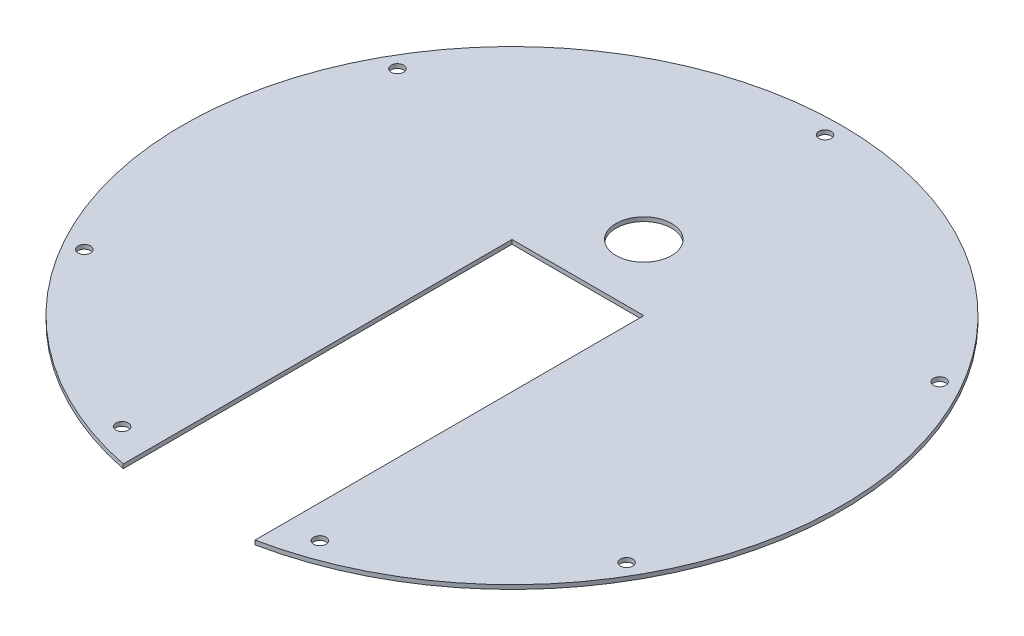
ISO-10303-21;
HEADER;
FILE_DESCRIPTION(('STEP AP214'),'2;1');
FILE_NAME('part.step','',(''),(''),'','','');
FILE_SCHEMA(('AUTOMOTIVE_DESIGN { 1 0 10303 214 1 1 1 1 }'));
ENDSEC;
DATA;
#1=APPLICATION_CONTEXT('core data for automotive mechanical design processes');
#2=APPLICATION_PROTOCOL_DEFINITION('international standard','automotive_design',2000,#1);
#3=PRODUCT_CONTEXT('',#1,'mechanical');
#4=PRODUCT('Part','Part','',(#3));
#5=PRODUCT_RELATED_PRODUCT_CATEGORY('part','',(#4));
#6=PRODUCT_DEFINITION_FORMATION('','',#4);
#7=PRODUCT_DEFINITION_CONTEXT('part definition',#1,'design');
#8=PRODUCT_DEFINITION('design','',#6,#7);
#9=PRODUCT_DEFINITION_SHAPE('','',#8);
#10=(LENGTH_UNIT() NAMED_UNIT(*) SI_UNIT(.MILLI.,.METRE.));
#11=(NAMED_UNIT(*) PLANE_ANGLE_UNIT() SI_UNIT($,.RADIAN.));
#12=(NAMED_UNIT(*) SI_UNIT($,.STERADIAN.) SOLID_ANGLE_UNIT());
#13=UNCERTAINTY_MEASURE_WITH_UNIT(LENGTH_MEASURE(1.E-05),#10,'distance_accuracy_value','');
#14=(GEOMETRIC_REPRESENTATION_CONTEXT(3) GLOBAL_UNCERTAINTY_ASSIGNED_CONTEXT((#13)) GLOBAL_UNIT_ASSIGNED_CONTEXT((#10,
#11,#12)) REPRESENTATION_CONTEXT('',''));
#15=CARTESIAN_POINT('',(0.,0.,0.));
#16=DIRECTION('',(0.,0.,1.));
#17=DIRECTION('',(1.,0.,0.));
#18=AXIS2_PLACEMENT_3D('',#15,#16,#17);
#19=CARTESIAN_POINT('',(0.,0.,0.));
#20=DIRECTION('',(0.,1.,0.));
#21=DIRECTION('',(0.,0.,1.));
#22=AXIS2_PLACEMENT_3D('',#19,#20,#21);
#23=PLANE('',#22);
#24=CARTESIAN_POINT('',(104.48596496659,0.,-60.325));
#25=DIRECTION('',(0.,1.,0.));
#26=DIRECTION('',(0.,0.,1.));
#27=AXIS2_PLACEMENT_3D('',#24,#25,#26);
#28=CIRCLE('',#27,2.38125);
#29=CARTESIAN_POINT('',(104.48596496659,0.,-57.94375));
#30=VERTEX_POINT('',#29);
#31=EDGE_CURVE('E118',#30,#30,#28,.T.);
#32=ORIENTED_EDGE('',*,*,#31,.T.);
#33=EDGE_LOOP('',(#32));
#34=FACE_BOUND('',#33,.T.);
#35=CARTESIAN_POINT('',(104.48596496659,0.,60.325));
#36=DIRECTION('',(0.,1.,0.));
#37=DIRECTION('',(0.,0.,1.));
#38=AXIS2_PLACEMENT_3D('',#35,#36,#37);
#39=CIRCLE('',#38,2.38125);
#40=CARTESIAN_POINT('',(104.48596496659,0.,62.70625));
#41=VERTEX_POINT('',#40);
#42=EDGE_CURVE('E121',#41,#41,#39,.T.);
#43=ORIENTED_EDGE('',*,*,#42,.T.);
#44=EDGE_LOOP('',(#43));
#45=FACE_BOUND('',#44,.T.);
#46=CARTESIAN_POINT('',(-104.48596496659,0.,60.325));
#47=DIRECTION('',(0.,1.,0.));
#48=DIRECTION('',(0.,0.,1.));
#49=AXIS2_PLACEMENT_3D('',#46,#47,#48);
#50=CIRCLE('',#49,2.38125);
#51=CARTESIAN_POINT('',(-104.48596496659,0.,62.70625));
#52=VERTEX_POINT('',#51);
#53=EDGE_CURVE('E124',#52,#52,#50,.T.);
#54=ORIENTED_EDGE('',*,*,#53,.T.);
#55=EDGE_LOOP('',(#54));
#56=FACE_BOUND('',#55,.T.);
#57=CARTESIAN_POINT('',(-104.48596496659,0.,-60.325));
#58=DIRECTION('',(0.,1.,0.));
#59=DIRECTION('',(0.,0.,1.));
#60=AXIS2_PLACEMENT_3D('',#57,#58,#59);
#61=CIRCLE('',#60,2.38125);
#62=CARTESIAN_POINT('',(-104.48596496659,0.,-57.94375));
#63=VERTEX_POINT('',#62);
#64=EDGE_CURVE('E127',#63,#63,#61,.T.);
#65=ORIENTED_EDGE('',*,*,#64,.T.);
#66=EDGE_LOOP('',(#65));
#67=FACE_BOUND('',#66,.T.);
#68=CARTESIAN_POINT('',(0.,0.,-120.65));
#69=DIRECTION('',(0.,1.,0.));
#70=DIRECTION('',(0.,0.,1.));
#71=AXIS2_PLACEMENT_3D('',#68,#69,#70);
#72=CIRCLE('',#71,2.38125);
#73=CARTESIAN_POINT('',(0.,0.,-118.26875));
#74=VERTEX_POINT('',#73);
#75=EDGE_CURVE('E130',#74,#74,#72,.T.);
#76=ORIENTED_EDGE('',*,*,#75,.T.);
#77=EDGE_LOOP('',(#76));
#78=FACE_BOUND('',#77,.T.);
#79=CARTESIAN_POINT('',(38.1,0.,112.144866026228));
#80=DIRECTION('',(0.,1.,0.));
#81=DIRECTION('',(0.,0.,1.));
#82=AXIS2_PLACEMENT_3D('',#79,#80,#81);
#83=CIRCLE('',#82,2.38125);
#84=CARTESIAN_POINT('',(38.1,0.,114.526116026228));
#85=VERTEX_POINT('',#84);
#86=EDGE_CURVE('E133',#85,#85,#83,.T.);
#87=ORIENTED_EDGE('',*,*,#86,.T.);
#88=EDGE_LOOP('',(#87));
#89=FACE_BOUND('',#88,.T.);
#90=CARTESIAN_POINT('',(-38.1,0.,112.144866026228));
#91=DIRECTION('',(0.,1.,0.));
#92=DIRECTION('',(0.,0.,1.));
#93=AXIS2_PLACEMENT_3D('',#90,#91,#92);
#94=CIRCLE('',#93,2.38125);
#95=CARTESIAN_POINT('',(-38.1,0.,114.526116026228));
#96=VERTEX_POINT('',#95);
#97=EDGE_CURVE('E136',#96,#96,#94,.T.);
#98=ORIENTED_EDGE('',*,*,#97,.T.);
#99=EDGE_LOOP('',(#98));
#100=FACE_BOUND('',#99,.T.);
#101=CARTESIAN_POINT('',(0.,0.,-50.8));
#102=DIRECTION('',(0.,1.,0.));
#103=DIRECTION('',(0.,0.,1.));
#104=AXIS2_PLACEMENT_3D('',#101,#102,#103);
#105=CIRCLE('',#104,10.7188);
#106=CARTESIAN_POINT('',(0.,0.,-40.0812));
#107=VERTEX_POINT('',#106);
#108=EDGE_CURVE('E81',#107,#107,#105,.T.);
#109=ORIENTED_EDGE('',*,*,#108,.T.);
#110=EDGE_LOOP('',(#109));
#111=FACE_BOUND('',#110,.T.);
#112=CARTESIAN_POINT('',(0.,0.,0.));
#113=DIRECTION('',(0.,1.,0.));
#114=DIRECTION('',(0.,0.,1.));
#115=AXIS2_PLACEMENT_3D('',#112,#113,#114);
#116=CIRCLE('',#115,127.);
#117=CARTESIAN_POINT('',(25.4000000000009,0.,124.434078933385));
#118=VERTEX_POINT('',#117);
#119=CARTESIAN_POINT('',(-25.4,0.,124.434078933381));
#120=VERTEX_POINT('',#119);
#121=EDGE_CURVE('E20',#118,#120,#116,.T.);
#122=ORIENTED_EDGE('',*,*,#121,.F.);
#123=DIRECTION('',(0.,0.,-1.));
#124=VECTOR('',#123,1.);
#125=CARTESIAN_POINT('',(25.4,0.,330.2));
#126=LINE('',#125,#124);
#127=CARTESIAN_POINT('',(25.4,0.,-25.4));
#128=VERTEX_POINT('',#127);
#129=EDGE_CURVE('E57',#118,#128,#126,.T.);
#130=ORIENTED_EDGE('',*,*,#129,.T.);
#131=DIRECTION('',(-1.,0.,0.));
#132=VECTOR('',#131,1.);
#133=CARTESIAN_POINT('',(25.4,0.,-25.4));
#134=LINE('',#133,#132);
#135=CARTESIAN_POINT('',(-25.4,0.,-25.4));
#136=VERTEX_POINT('',#135);
#137=EDGE_CURVE('E86',#128,#136,#134,.T.);
#138=ORIENTED_EDGE('',*,*,#137,.T.);
#139=DIRECTION('',(0.,0.,1.));
#140=VECTOR('',#139,1.);
#141=CARTESIAN_POINT('',(-25.4,0.,-25.4));
#142=LINE('',#141,#140);
#143=EDGE_CURVE('E54',#136,#120,#142,.T.);
#144=ORIENTED_EDGE('',*,*,#143,.T.);
#145=EDGE_LOOP('',(#122,#130,#138,#144));
#146=FACE_BOUND('',#145,.T.);
#147=ADVANCED_FACE('F17',(#34,#45,#56,#67,#78,#89,#100,#111,#146),#23,.F.);
#148=CARTESIAN_POINT('',(25.4,1.6002,330.2));
#149=DIRECTION('',(1.,0.,0.));
#150=DIRECTION('',(0.,0.,-1.));
#151=AXIS2_PLACEMENT_3D('',#148,#149,#150);
#152=PLANE('',#151);
#153=DIRECTION('',(0.,0.,1.));
#154=VECTOR('',#153,1.);
#155=CARTESIAN_POINT('',(25.4,1.6002,0.));
#156=LINE('',#155,#154);
#157=CARTESIAN_POINT('',(25.4,1.6002,-25.4));
#158=VERTEX_POINT('',#157);
#159=CARTESIAN_POINT('',(25.4000000000009,1.6002,124.434078933385));
#160=VERTEX_POINT('',#159);
#161=EDGE_CURVE('E117',#158,#160,#156,.T.);
#162=ORIENTED_EDGE('',*,*,#161,.F.);
#163=DIRECTION('',(0.,1.,0.));
#164=VECTOR('',#163,1.);
#165=CARTESIAN_POINT('',(25.4,1.6002,-25.4));
#166=LINE('',#165,#164);
#167=EDGE_CURVE('E69',#158,#128,#166,.F.);
#168=ORIENTED_EDGE('',*,*,#167,.T.);
#169=ORIENTED_EDGE('',*,*,#129,.F.);
#170=DIRECTION('',(0.,1.,0.));
#171=VECTOR('',#170,1.);
#172=CARTESIAN_POINT('',(25.4000000000018,0.,124.434078933385));
#173=LINE('',#172,#171);
#174=EDGE_CURVE('E63',#160,#118,#173,.F.);
#175=ORIENTED_EDGE('',*,*,#174,.F.);
#176=EDGE_LOOP('',(#162,#168,#169,#175));
#177=FACE_BOUND('',#176,.T.);
#178=ADVANCED_FACE('F66',(#177),#152,.F.);
#179=CARTESIAN_POINT('',(0.,0.,0.));
#180=DIRECTION('',(0.,1.,0.));
#181=DIRECTION('',(0.,0.,1.));
#182=AXIS2_PLACEMENT_3D('',#179,#180,#181);
#183=CYLINDRICAL_SURFACE('',#182,127.);
#184=ORIENTED_EDGE('',*,*,#174,.T.);
#185=ORIENTED_EDGE('',*,*,#121,.T.);
#186=DIRECTION('',(0.,1.,0.));
#187=VECTOR('',#186,1.);
#188=CARTESIAN_POINT('',(-25.4,1.6002,124.434078933376));
#189=LINE('',#188,#187);
#190=CARTESIAN_POINT('',(-25.4,1.6002,124.434078933381));
#191=VERTEX_POINT('',#190);
#192=EDGE_CURVE('E88',#120,#191,#189,.T.);
#193=ORIENTED_EDGE('',*,*,#192,.T.);
#194=CARTESIAN_POINT('',(0.,1.6002,0.));
#195=DIRECTION('',(0.,1.,0.));
#196=DIRECTION('',(0.,0.,1.));
#197=AXIS2_PLACEMENT_3D('',#194,#195,#196);
#198=CIRCLE('',#197,127.);
#199=EDGE_CURVE('E73',#160,#191,#198,.T.);
#200=ORIENTED_EDGE('',*,*,#199,.F.);
#201=EDGE_LOOP('',(#184,#185,#193,#200));
#202=FACE_BOUND('',#201,.T.);
#203=ADVANCED_FACE('F72',(#202),#183,.T.);
#204=CARTESIAN_POINT('',(-25.4,1.6002,-25.4));
#205=DIRECTION('',(-1.,0.,0.));
#206=DIRECTION('',(0.,0.,1.));
#207=AXIS2_PLACEMENT_3D('',#204,#205,#206);
#208=PLANE('',#207);
#209=DIRECTION('',(0.,0.,1.));
#210=VECTOR('',#209,1.);
#211=CARTESIAN_POINT('',(-25.4,1.6002,0.));
#212=LINE('',#211,#210);
#213=CARTESIAN_POINT('',(-25.4,1.6002,-25.4));
#214=VERTEX_POINT('',#213);
#215=EDGE_CURVE('E116',#191,#214,#212,.F.);
#216=ORIENTED_EDGE('',*,*,#215,.F.);
#217=ORIENTED_EDGE('',*,*,#192,.F.);
#218=ORIENTED_EDGE('',*,*,#143,.F.);
#219=DIRECTION('',(0.,1.,0.));
#220=VECTOR('',#219,1.);
#221=CARTESIAN_POINT('',(-25.4,1.6002,-25.4));
#222=LINE('',#221,#220);
#223=EDGE_CURVE('E35',#136,#214,#222,.T.);
#224=ORIENTED_EDGE('',*,*,#223,.T.);
#225=EDGE_LOOP('',(#216,#217,#218,#224));
#226=FACE_BOUND('',#225,.T.);
#227=ADVANCED_FACE('F156',(#226),#208,.F.);
#228=CARTESIAN_POINT('',(25.4,1.6002,-25.4));
#229=DIRECTION('',(0.,0.,-1.));
#230=DIRECTION('',(-1.,0.,0.));
#231=AXIS2_PLACEMENT_3D('',#228,#229,#230);
#232=PLANE('',#231);
#233=DIRECTION('',(1.,0.,0.));
#234=VECTOR('',#233,1.);
#235=CARTESIAN_POINT('',(0.,1.6002,-25.4));
#236=LINE('',#235,#234);
#237=EDGE_CURVE('E114',#214,#158,#236,.T.);
#238=ORIENTED_EDGE('',*,*,#237,.F.);
#239=ORIENTED_EDGE('',*,*,#223,.F.);
#240=ORIENTED_EDGE('',*,*,#137,.F.);
#241=ORIENTED_EDGE('',*,*,#167,.F.);
#242=EDGE_LOOP('',(#238,#239,#240,#241));
#243=FACE_BOUND('',#242,.T.);
#244=ADVANCED_FACE('F145',(#243),#232,.F.);
#245=CARTESIAN_POINT('',(0.,1.6002,-50.8));
#246=DIRECTION('',(0.,1.,0.));
#247=DIRECTION('',(0.,0.,1.));
#248=AXIS2_PLACEMENT_3D('',#245,#246,#247);
#249=CYLINDRICAL_SURFACE('',#248,10.7188);
#250=CARTESIAN_POINT('',(0.,1.6002,-50.8));
#251=DIRECTION('',(0.,1.,0.));
#252=DIRECTION('',(0.,0.,1.));
#253=AXIS2_PLACEMENT_3D('',#250,#251,#252);
#254=CIRCLE('',#253,10.7188);
#255=CARTESIAN_POINT('',(0.,1.6002,-40.0812));
#256=VERTEX_POINT('',#255);
#257=EDGE_CURVE('E111',#256,#256,#254,.F.);
#258=ORIENTED_EDGE('',*,*,#257,.F.);
#259=EDGE_LOOP('',(#258));
#260=FACE_BOUND('',#259,.T.);
#261=ORIENTED_EDGE('',*,*,#108,.F.);
#262=EDGE_LOOP('',(#261));
#263=FACE_BOUND('',#262,.T.);
#264=ADVANCED_FACE('F142',(#260,#263),#249,.F.);
#265=CARTESIAN_POINT('',(-38.1,1.6002,112.144866026228));
#266=DIRECTION('',(0.,1.,0.));
#267=DIRECTION('',(0.,0.,1.));
#268=AXIS2_PLACEMENT_3D('',#265,#266,#267);
#269=CYLINDRICAL_SURFACE('',#268,2.38125);
#270=CARTESIAN_POINT('',(-38.1,1.6002,112.144866026228));
#271=DIRECTION('',(0.,1.,0.));
#272=DIRECTION('',(0.,0.,1.));
#273=AXIS2_PLACEMENT_3D('',#270,#271,#272);
#274=CIRCLE('',#273,2.38125);
#275=CARTESIAN_POINT('',(-38.1,1.6002,114.526116026228));
#276=VERTEX_POINT('',#275);
#277=EDGE_CURVE('E108',#276,#276,#274,.F.);
#278=ORIENTED_EDGE('',*,*,#277,.F.);
#279=EDGE_LOOP('',(#278));
#280=FACE_BOUND('',#279,.T.);
#281=ORIENTED_EDGE('',*,*,#97,.F.);
#282=EDGE_LOOP('',(#281));
#283=FACE_BOUND('',#282,.T.);
#284=ADVANCED_FACE('F144',(#280,#283),#269,.F.);
#285=CARTESIAN_POINT('',(38.1,1.6002,112.144866026228));
#286=DIRECTION('',(0.,1.,0.));
#287=DIRECTION('',(0.,0.,1.));
#288=AXIS2_PLACEMENT_3D('',#285,#286,#287);
#289=CYLINDRICAL_SURFACE('',#288,2.38125);
#290=CARTESIAN_POINT('',(38.1,1.6002,112.144866026228));
#291=DIRECTION('',(0.,1.,0.));
#292=DIRECTION('',(0.,0.,1.));
#293=AXIS2_PLACEMENT_3D('',#290,#291,#292);
#294=CIRCLE('',#293,2.38125);
#295=CARTESIAN_POINT('',(38.1,1.6002,114.526116026228));
#296=VERTEX_POINT('',#295);
#297=EDGE_CURVE('E105',#296,#296,#294,.F.);
#298=ORIENTED_EDGE('',*,*,#297,.F.);
#299=EDGE_LOOP('',(#298));
#300=FACE_BOUND('',#299,.T.);
#301=ORIENTED_EDGE('',*,*,#86,.F.);
#302=EDGE_LOOP('',(#301));
#303=FACE_BOUND('',#302,.T.);
#304=ADVANCED_FACE('F153',(#300,#303),#289,.F.);
#305=CARTESIAN_POINT('',(0.,1.6002,-120.65));
#306=DIRECTION('',(0.,1.,0.));
#307=DIRECTION('',(0.,0.,1.));
#308=AXIS2_PLACEMENT_3D('',#305,#306,#307);
#309=CYLINDRICAL_SURFACE('',#308,2.38125);
#310=CARTESIAN_POINT('',(0.,1.6002,-120.65));
#311=DIRECTION('',(0.,1.,0.));
#312=DIRECTION('',(0.,0.,1.));
#313=AXIS2_PLACEMENT_3D('',#310,#311,#312);
#314=CIRCLE('',#313,2.38125);
#315=CARTESIAN_POINT('',(0.,1.6002,-118.26875));
#316=VERTEX_POINT('',#315);
#317=EDGE_CURVE('E102',#316,#316,#314,.F.);
#318=ORIENTED_EDGE('',*,*,#317,.F.);
#319=EDGE_LOOP('',(#318));
#320=FACE_BOUND('',#319,.T.);
#321=ORIENTED_EDGE('',*,*,#75,.F.);
#322=EDGE_LOOP('',(#321));
#323=FACE_BOUND('',#322,.T.);
#324=ADVANCED_FACE('F183',(#320,#323),#309,.F.);
#325=CARTESIAN_POINT('',(-104.48596496659,1.6002,-60.325));
#326=DIRECTION('',(0.,1.,0.));
#327=DIRECTION('',(0.,0.,1.));
#328=AXIS2_PLACEMENT_3D('',#325,#326,#327);
#329=CYLINDRICAL_SURFACE('',#328,2.38125);
#330=CARTESIAN_POINT('',(-104.48596496659,1.6002,-60.325));
#331=DIRECTION('',(0.,1.,0.));
#332=DIRECTION('',(0.,0.,1.));
#333=AXIS2_PLACEMENT_3D('',#330,#331,#332);
#334=CIRCLE('',#333,2.38125);
#335=CARTESIAN_POINT('',(-104.48596496659,1.6002,-57.94375));
#336=VERTEX_POINT('',#335);
#337=EDGE_CURVE('E99',#336,#336,#334,.F.);
#338=ORIENTED_EDGE('',*,*,#337,.F.);
#339=EDGE_LOOP('',(#338));
#340=FACE_BOUND('',#339,.T.);
#341=ORIENTED_EDGE('',*,*,#64,.F.);
#342=EDGE_LOOP('',(#341));
#343=FACE_BOUND('',#342,.T.);
#344=ADVANCED_FACE('F179',(#340,#343),#329,.F.);
#345=CARTESIAN_POINT('',(-104.48596496659,1.6002,60.325));
#346=DIRECTION('',(0.,1.,0.));
#347=DIRECTION('',(0.,0.,1.));
#348=AXIS2_PLACEMENT_3D('',#345,#346,#347);
#349=CYLINDRICAL_SURFACE('',#348,2.38125);
#350=CARTESIAN_POINT('',(-104.48596496659,1.6002,60.325));
#351=DIRECTION('',(0.,1.,0.));
#352=DIRECTION('',(0.,0.,1.));
#353=AXIS2_PLACEMENT_3D('',#350,#351,#352);
#354=CIRCLE('',#353,2.38125);
#355=CARTESIAN_POINT('',(-104.48596496659,1.6002,62.70625));
#356=VERTEX_POINT('',#355);
#357=EDGE_CURVE('E96',#356,#356,#354,.F.);
#358=ORIENTED_EDGE('',*,*,#357,.F.);
#359=EDGE_LOOP('',(#358));
#360=FACE_BOUND('',#359,.T.);
#361=ORIENTED_EDGE('',*,*,#53,.F.);
#362=EDGE_LOOP('',(#361));
#363=FACE_BOUND('',#362,.T.);
#364=ADVANCED_FACE('F175',(#360,#363),#349,.F.);
#365=CARTESIAN_POINT('',(104.48596496659,1.6002,60.325));
#366=DIRECTION('',(0.,1.,0.));
#367=DIRECTION('',(0.,0.,1.));
#368=AXIS2_PLACEMENT_3D('',#365,#366,#367);
#369=CYLINDRICAL_SURFACE('',#368,2.38125);
#370=CARTESIAN_POINT('',(104.48596496659,1.6002,60.325));
#371=DIRECTION('',(0.,1.,0.));
#372=DIRECTION('',(0.,0.,1.));
#373=AXIS2_PLACEMENT_3D('',#370,#371,#372);
#374=CIRCLE('',#373,2.38125);
#375=CARTESIAN_POINT('',(104.48596496659,1.6002,62.70625));
#376=VERTEX_POINT('',#375);
#377=EDGE_CURVE('E26',#376,#376,#374,.F.);
#378=ORIENTED_EDGE('',*,*,#377,.F.);
#379=EDGE_LOOP('',(#378));
#380=FACE_BOUND('',#379,.T.);
#381=ORIENTED_EDGE('',*,*,#42,.F.);
#382=EDGE_LOOP('',(#381));
#383=FACE_BOUND('',#382,.T.);
#384=ADVANCED_FACE('F168',(#380,#383),#369,.F.);
#385=CARTESIAN_POINT('',(104.48596496659,1.6002,-60.325));
#386=DIRECTION('',(0.,1.,0.));
#387=DIRECTION('',(0.,0.,1.));
#388=AXIS2_PLACEMENT_3D('',#385,#386,#387);
#389=CYLINDRICAL_SURFACE('',#388,2.38125);
#390=CARTESIAN_POINT('',(104.48596496659,1.6002,-60.325));
#391=DIRECTION('',(0.,1.,0.));
#392=DIRECTION('',(0.,0.,1.));
#393=AXIS2_PLACEMENT_3D('',#390,#391,#392);
#394=CIRCLE('',#393,2.38125);
#395=CARTESIAN_POINT('',(104.48596496659,1.6002,-57.94375));
#396=VERTEX_POINT('',#395);
#397=EDGE_CURVE('E11',#396,#396,#394,.F.);
#398=ORIENTED_EDGE('',*,*,#397,.F.);
#399=EDGE_LOOP('',(#398));
#400=FACE_BOUND('',#399,.T.);
#401=ORIENTED_EDGE('',*,*,#31,.F.);
#402=EDGE_LOOP('',(#401));
#403=FACE_BOUND('',#402,.T.);
#404=ADVANCED_FACE('F162',(#400,#403),#389,.F.);
#405=CARTESIAN_POINT('',(0.,1.6002,0.));
#406=DIRECTION('',(0.,1.,0.));
#407=DIRECTION('',(0.,0.,1.));
#408=AXIS2_PLACEMENT_3D('',#405,#406,#407);
#409=PLANE('',#408);
#410=ORIENTED_EDGE('',*,*,#397,.T.);
#411=EDGE_LOOP('',(#410));
#412=FACE_BOUND('',#411,.T.);
#413=ORIENTED_EDGE('',*,*,#377,.T.);
#414=EDGE_LOOP('',(#413));
#415=FACE_BOUND('',#414,.T.);
#416=ORIENTED_EDGE('',*,*,#357,.T.);
#417=EDGE_LOOP('',(#416));
#418=FACE_BOUND('',#417,.T.);
#419=ORIENTED_EDGE('',*,*,#337,.T.);
#420=EDGE_LOOP('',(#419));
#421=FACE_BOUND('',#420,.T.);
#422=ORIENTED_EDGE('',*,*,#317,.T.);
#423=EDGE_LOOP('',(#422));
#424=FACE_BOUND('',#423,.T.);
#425=ORIENTED_EDGE('',*,*,#297,.T.);
#426=EDGE_LOOP('',(#425));
#427=FACE_BOUND('',#426,.T.);
#428=ORIENTED_EDGE('',*,*,#277,.T.);
#429=EDGE_LOOP('',(#428));
#430=FACE_BOUND('',#429,.T.);
#431=ORIENTED_EDGE('',*,*,#257,.T.);
#432=EDGE_LOOP('',(#431));
#433=FACE_BOUND('',#432,.T.);
#434=ORIENTED_EDGE('',*,*,#215,.T.);
#435=ORIENTED_EDGE('',*,*,#237,.T.);
#436=ORIENTED_EDGE('',*,*,#161,.T.);
#437=ORIENTED_EDGE('',*,*,#199,.T.);
#438=EDGE_LOOP('',(#434,#435,#436,#437));
#439=FACE_BOUND('',#438,.T.);
#440=ADVANCED_FACE('F160',(#412,#415,#418,#421,#424,#427,#430,#433,#439),#409,.T.);
#441=CLOSED_SHELL('',(#147,#178,#203,#227,#244,#264,#284,#304,#324,#344,#364,#384,#404,#440));
#442=MANIFOLD_SOLID_BREP('B1',#441);
#443=ADVANCED_BREP_SHAPE_REPRESENTATION('',(#18,#442),#14);
#444=SHAPE_DEFINITION_REPRESENTATION(#9,#443);
ENDSEC;
END-ISO-10303-21;
